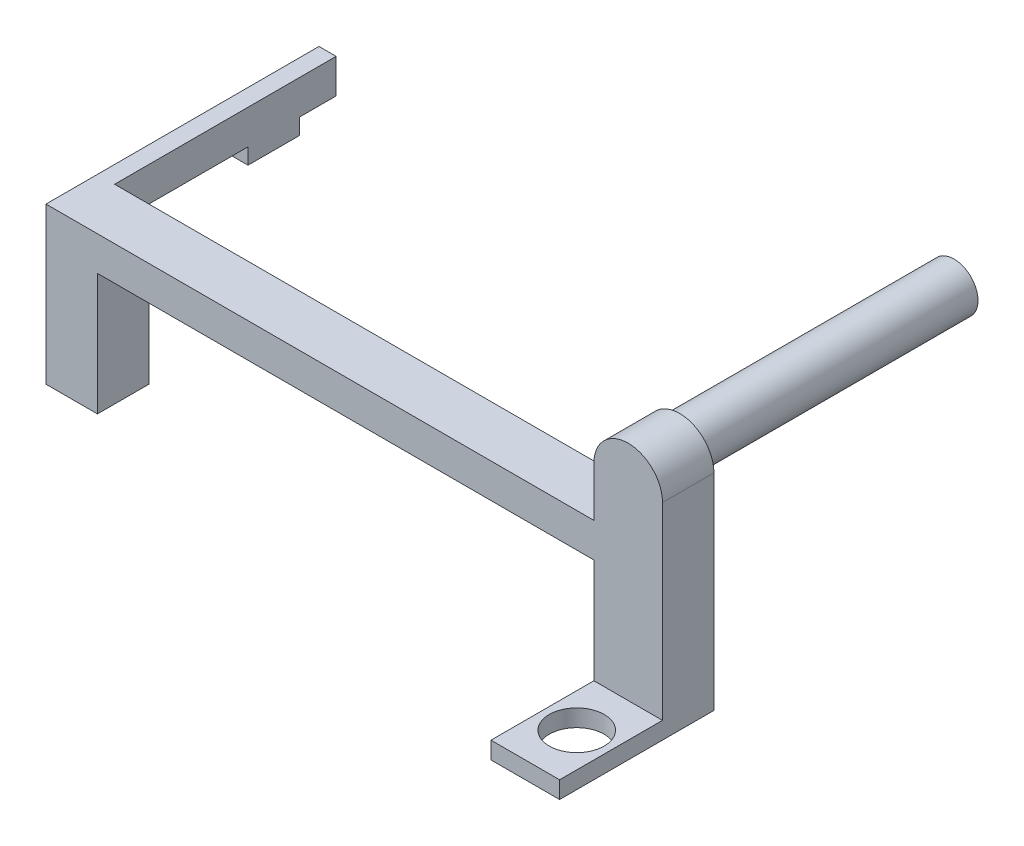
ISO-10303-21;
HEADER;
FILE_DESCRIPTION(('STEP AP214'),'2;1');
FILE_NAME('part.step','',(''),(''),'','','');
FILE_SCHEMA(('AUTOMOTIVE_DESIGN { 1 0 10303 214 1 1 1 1 }'));
ENDSEC;
DATA;
#1=APPLICATION_CONTEXT('core data for automotive mechanical design processes');
#2=APPLICATION_PROTOCOL_DEFINITION('international standard','automotive_design',2000,#1);
#3=PRODUCT_CONTEXT('',#1,'mechanical');
#4=PRODUCT('Part','Part','',(#3));
#5=PRODUCT_RELATED_PRODUCT_CATEGORY('part','',(#4));
#6=PRODUCT_DEFINITION_FORMATION('','',#4);
#7=PRODUCT_DEFINITION_CONTEXT('part definition',#1,'design');
#8=PRODUCT_DEFINITION('design','',#6,#7);
#9=PRODUCT_DEFINITION_SHAPE('','',#8);
#10=(LENGTH_UNIT() NAMED_UNIT(*) SI_UNIT(.MILLI.,.METRE.));
#11=(NAMED_UNIT(*) PLANE_ANGLE_UNIT() SI_UNIT($,.RADIAN.));
#12=(NAMED_UNIT(*) SI_UNIT($,.STERADIAN.) SOLID_ANGLE_UNIT());
#13=UNCERTAINTY_MEASURE_WITH_UNIT(LENGTH_MEASURE(1.E-05),#10,'distance_accuracy_value','');
#14=(GEOMETRIC_REPRESENTATION_CONTEXT(3) GLOBAL_UNCERTAINTY_ASSIGNED_CONTEXT((#13)) GLOBAL_UNIT_ASSIGNED_CONTEXT((#10,
#11,#12)) REPRESENTATION_CONTEXT('',''));
#15=CARTESIAN_POINT('',(0.,0.,0.));
#16=DIRECTION('',(0.,0.,1.));
#17=DIRECTION('',(1.,0.,0.));
#18=AXIS2_PLACEMENT_3D('',#15,#16,#17);
#19=CARTESIAN_POINT('',(-34.3841463414634,-3.49756097560976,0.));
#20=DIRECTION('',(0.,1.,0.));
#21=DIRECTION('',(-1.,0.,0.));
#22=AXIS2_PLACEMENT_3D('',#19,#20,#21);
#23=PLANE('',#22);
#24=DIRECTION('',(1.,0.,0.));
#25=VECTOR('',#24,1.);
#26=CARTESIAN_POINT('',(-35.3841463414634,-3.49756097560976,0.));
#27=LINE('',#26,#25);
#28=CARTESIAN_POINT('',(-35.3841463414634,-3.49756097560976,0.));
#29=VERTEX_POINT('',#28);
#30=CARTESIAN_POINT('',(-34.3841463414634,-3.49756097560976,0.));
#31=VERTEX_POINT('',#30);
#32=EDGE_CURVE('E406',#29,#31,#27,.T.);
#33=ORIENTED_EDGE('',*,*,#32,.F.);
#34=DIRECTION('',(0.,0.,1.));
#35=VECTOR('',#34,1.);
#36=CARTESIAN_POINT('',(-35.3841463414634,-3.49756097560976,0.));
#37=LINE('',#36,#35);
#38=CARTESIAN_POINT('',(-35.3841463414634,-3.49756097560976,-7.78));
#39=VERTEX_POINT('',#38);
#40=EDGE_CURVE('E66',#39,#29,#37,.T.);
#41=ORIENTED_EDGE('',*,*,#40,.F.);
#42=DIRECTION('',(-1.,0.,0.));
#43=VECTOR('',#42,1.);
#44=CARTESIAN_POINT('',(-35.3841463414634,-3.49756097560976,-7.78));
#45=LINE('',#44,#43);
#46=CARTESIAN_POINT('',(-34.3841463414634,-3.49756097560976,-7.78));
#47=VERTEX_POINT('',#46);
#48=EDGE_CURVE('E212',#47,#39,#45,.T.);
#49=ORIENTED_EDGE('',*,*,#48,.F.);
#50=DIRECTION('',(0.,0.,1.));
#51=VECTOR('',#50,1.);
#52=CARTESIAN_POINT('',(-34.3841463414634,-3.49756097560976,-3.));
#53=LINE('',#52,#51);
#54=EDGE_CURVE('E268',#47,#31,#53,.T.);
#55=ORIENTED_EDGE('',*,*,#54,.T.);
#56=EDGE_LOOP('',(#33,#41,#49,#55));
#57=FACE_BOUND('',#56,.T.);
#58=ADVANCED_FACE('F49',(#57),#23,.F.);
#59=DIRECTION('',(0.,0.,1.));
#60=VECTOR('',#59,1.);
#61=CARTESIAN_POINT('',(-32.3841463414634,-3.49756097560976,3.));
#62=LINE('',#61,#60);
#63=CARTESIAN_POINT('',(-32.3841463414634,-3.49756097560976,0.));
#64=VERTEX_POINT('',#63);
#65=CARTESIAN_POINT('',(-32.3841463414634,-3.49756097560976,3.));
#66=VERTEX_POINT('',#65);
#67=EDGE_CURVE('E204',#64,#66,#62,.T.);
#68=ORIENTED_EDGE('',*,*,#67,.F.);
#69=DIRECTION('',(1.,0.,0.));
#70=VECTOR('',#69,1.);
#71=CARTESIAN_POINT('',(-34.3841463414634,-3.49756097560976,0.));
#72=LINE('',#71,#70);
#73=CARTESIAN_POINT('',(-3.43414634146343,-3.49756097560976,0.));
#74=VERTEX_POINT('',#73);
#75=EDGE_CURVE('E302',#64,#74,#72,.T.);
#76=ORIENTED_EDGE('',*,*,#75,.T.);
#77=DIRECTION('',(0.,0.,1.));
#78=VECTOR('',#77,1.);
#79=CARTESIAN_POINT('',(-3.43414634146343,-3.49756097560976,0.));
#80=LINE('',#79,#78);
#81=CARTESIAN_POINT('',(-3.43414634146343,-3.49756097560976,3.));
#82=VERTEX_POINT('',#81);
#83=EDGE_CURVE('E284',#74,#82,#80,.T.);
#84=ORIENTED_EDGE('',*,*,#83,.T.);
#85=DIRECTION('',(1.,0.,0.));
#86=VECTOR('',#85,1.);
#87=CARTESIAN_POINT('',(-34.3841463414634,-3.49756097560976,3.));
#88=LINE('',#87,#86);
#89=EDGE_CURVE('E299',#66,#82,#88,.T.);
#90=ORIENTED_EDGE('',*,*,#89,.F.);
#91=EDGE_LOOP('',(#68,#76,#84,#90));
#92=FACE_BOUND('',#91,.T.);
#93=ADVANCED_FACE('F449',(#92),#23,.F.);
#94=DIRECTION('',(1.,0.,0.));
#95=VECTOR('',#94,1.);
#96=CARTESIAN_POINT('',(-35.3841463414634,-3.49756097560976,-10.78));
#97=LINE('',#96,#95);
#98=CARTESIAN_POINT('',(-35.3841463414634,-3.49756097560976,-10.78));
#99=VERTEX_POINT('',#98);
#100=CARTESIAN_POINT('',(-34.3841463414634,-3.49756097560976,-10.78));
#101=VERTEX_POINT('',#100);
#102=EDGE_CURVE('E74',#99,#101,#97,.T.);
#103=ORIENTED_EDGE('',*,*,#102,.F.);
#104=CARTESIAN_POINT('',(-35.3841463414634,-3.49756097560976,-12.92));
#105=VERTEX_POINT('',#104);
#106=EDGE_CURVE('E275',#105,#99,#37,.T.);
#107=ORIENTED_EDGE('',*,*,#106,.F.);
#108=DIRECTION('',(-1.,0.,0.));
#109=VECTOR('',#108,1.);
#110=CARTESIAN_POINT('',(-34.3841463414634,-3.49756097560976,-12.92));
#111=LINE('',#110,#109);
#112=CARTESIAN_POINT('',(-34.3841463414634,-3.49756097560976,-12.92));
#113=VERTEX_POINT('',#112);
#114=EDGE_CURVE('E252',#113,#105,#111,.T.);
#115=ORIENTED_EDGE('',*,*,#114,.F.);
#116=EDGE_CURVE('E269',#113,#101,#53,.T.);
#117=ORIENTED_EDGE('',*,*,#116,.T.);
#118=EDGE_LOOP('',(#103,#107,#115,#117));
#119=FACE_BOUND('',#118,.T.);
#120=ADVANCED_FACE('F451',(#119),#23,.F.);
#121=CARTESIAN_POINT('',(0.,0.,0.));
#122=DIRECTION('',(0.,0.,1.));
#123=DIRECTION('',(1.,0.,0.));
#124=AXIS2_PLACEMENT_3D('',#121,#122,#123);
#125=PLANE('',#124);
#126=CARTESIAN_POINT('',(-1.43414634146342,1.80243902439024,0.));
#127=DIRECTION('',(0.,0.,1.));
#128=DIRECTION('',(1.,0.,0.));
#129=AXIS2_PLACEMENT_3D('',#126,#127,#128);
#130=CIRCLE('',#129,1.4);
#131=CARTESIAN_POINT('',(-0.034146341463424,1.80243902439024,0.));
#132=VERTEX_POINT('',#131);
#133=EDGE_CURVE('E371',#132,#132,#130,.F.);
#134=ORIENTED_EDGE('',*,*,#133,.F.);
#135=EDGE_LOOP('',(#134));
#136=FACE_BOUND('',#135,.T.);
#137=DIRECTION('',(0.,-1.,0.));
#138=VECTOR('',#137,1.);
#139=CARTESIAN_POINT('',(-34.3841463414634,-1.49756097560976,0.));
#140=LINE('',#139,#138);
#141=CARTESIAN_POINT('',(-34.3841463414634,-1.49756097560976,0.));
#142=VERTEX_POINT('',#141);
#143=EDGE_CURVE('E264',#142,#31,#140,.T.);
#144=ORIENTED_EDGE('',*,*,#143,.F.);
#145=DIRECTION('',(1.,0.,0.));
#146=VECTOR('',#145,1.);
#147=CARTESIAN_POINT('',(-34.3841463414634,-1.49756097560976,0.));
#148=LINE('',#147,#146);
#149=CARTESIAN_POINT('',(-3.43414634146343,-1.49756097560976,0.));
#150=VERTEX_POINT('',#149);
#151=EDGE_CURVE('E292',#142,#150,#148,.T.);
#152=ORIENTED_EDGE('',*,*,#151,.T.);
#153=DIRECTION('',(0.,-1.,0.));
#154=VECTOR('',#153,1.);
#155=CARTESIAN_POINT('',(-3.43414634146343,3.40243902439024,0.));
#156=LINE('',#155,#154);
#157=CARTESIAN_POINT('',(-3.43414634146343,1.40243902439024,0.));
#158=VERTEX_POINT('',#157);
#159=EDGE_CURVE('E353',#158,#150,#156,.T.);
#160=ORIENTED_EDGE('',*,*,#159,.F.);
#161=CARTESIAN_POINT('',(-1.43414634146343,1.40243902439024,0.));
#162=DIRECTION('',(0.,0.,1.));
#163=DIRECTION('',(1.,0.,0.));
#164=AXIS2_PLACEMENT_3D('',#161,#162,#163);
#165=CIRCLE('',#164,2.);
#166=CARTESIAN_POINT('',(0.565853658536575,1.40243902439024,0.));
#167=VERTEX_POINT('',#166);
#168=EDGE_CURVE('E11',#158,#167,#165,.F.);
#169=ORIENTED_EDGE('',*,*,#168,.T.);
#170=DIRECTION('',(0.,1.,0.));
#171=VECTOR('',#170,1.);
#172=CARTESIAN_POINT('',(0.565853658536575,3.40243902439024,0.));
#173=LINE('',#172,#171);
#174=CARTESIAN_POINT('',(0.565853658536576,-10.5975609756098,0.));
#175=VERTEX_POINT('',#174);
#176=EDGE_CURVE('E360',#175,#167,#173,.T.);
#177=ORIENTED_EDGE('',*,*,#176,.F.);
#178=DIRECTION('',(1.,0.,0.));
#179=VECTOR('',#178,1.);
#180=CARTESIAN_POINT('',(-3.43414634146342,-10.5975609756098,0.));
#181=LINE('',#180,#179);
#182=CARTESIAN_POINT('',(-3.43414634146342,-10.5975609756098,0.));
#183=VERTEX_POINT('',#182);
#184=EDGE_CURVE('E357',#183,#175,#181,.T.);
#185=ORIENTED_EDGE('',*,*,#184,.F.);
#186=EDGE_CURVE('E343',#74,#183,#156,.T.);
#187=ORIENTED_EDGE('',*,*,#186,.F.);
#188=ORIENTED_EDGE('',*,*,#75,.F.);
#189=DIRECTION('',(0.,1.,0.));
#190=VECTOR('',#189,1.);
#191=CARTESIAN_POINT('',(-32.3841463414634,-10.5975609756098,0.));
#192=LINE('',#191,#190);
#193=CARTESIAN_POINT('',(-32.3841463414634,-10.5975609756098,0.));
#194=VERTEX_POINT('',#193);
#195=EDGE_CURVE('E189',#194,#64,#192,.T.);
#196=ORIENTED_EDGE('',*,*,#195,.F.);
#197=DIRECTION('',(1.,0.,0.));
#198=VECTOR('',#197,1.);
#199=CARTESIAN_POINT('',(-35.3841463414634,-10.5975609756098,0.));
#200=LINE('',#199,#198);
#201=CARTESIAN_POINT('',(-35.3841463414634,-10.5975609756098,0.));
#202=VERTEX_POINT('',#201);
#203=EDGE_CURVE('E182',#202,#194,#200,.T.);
#204=ORIENTED_EDGE('',*,*,#203,.F.);
#205=DIRECTION('',(0.,1.,0.));
#206=VECTOR('',#205,1.);
#207=CARTESIAN_POINT('',(-35.3841463414634,-10.5975609756098,0.));
#208=LINE('',#207,#206);
#209=EDGE_CURVE('E187',#202,#29,#208,.T.);
#210=ORIENTED_EDGE('',*,*,#209,.T.);
#211=ORIENTED_EDGE('',*,*,#32,.T.);
#212=EDGE_LOOP('',(#144,#152,#160,#169,#177,#185,#187,#188,#196,#204,#210,#211));
#213=FACE_BOUND('',#212,.T.);
#214=ADVANCED_FACE('F185',(#136,#213),#125,.F.);
#215=CARTESIAN_POINT('',(-3.43414634146343,3.40243902439024,3.));
#216=DIRECTION('',(1.,0.,0.));
#217=DIRECTION('',(0.,1.,0.));
#218=AXIS2_PLACEMENT_3D('',#215,#216,#217);
#219=PLANE('',#218);
#220=ORIENTED_EDGE('',*,*,#83,.F.);
#221=ORIENTED_EDGE('',*,*,#186,.T.);
#222=DIRECTION('',(0.,0.,-1.));
#223=VECTOR('',#222,1.);
#224=CARTESIAN_POINT('',(-3.43414634146342,-10.5975609756098,3.));
#225=LINE('',#224,#223);
#226=CARTESIAN_POINT('',(-3.43414634146342,-10.5975609756098,9.));
#227=VERTEX_POINT('',#226);
#228=EDGE_CURVE('E367',#227,#183,#225,.T.);
#229=ORIENTED_EDGE('',*,*,#228,.F.);
#230=DIRECTION('',(0.,-1.,0.));
#231=VECTOR('',#230,1.);
#232=CARTESIAN_POINT('',(-3.43414634146343,-9.59756097560976,9.));
#233=LINE('',#232,#231);
#234=CARTESIAN_POINT('',(-3.43414634146343,-9.59756097560976,9.));
#235=VERTEX_POINT('',#234);
#236=EDGE_CURVE('E314',#235,#227,#233,.T.);
#237=ORIENTED_EDGE('',*,*,#236,.F.);
#238=DIRECTION('',(0.,0.,-1.));
#239=VECTOR('',#238,1.);
#240=CARTESIAN_POINT('',(-3.43414634146343,-9.59756097560976,9.));
#241=LINE('',#240,#239);
#242=CARTESIAN_POINT('',(-3.43414634146343,-9.59756097560976,3.));
#243=VERTEX_POINT('',#242);
#244=EDGE_CURVE('E328',#235,#243,#241,.T.);
#245=ORIENTED_EDGE('',*,*,#244,.T.);
#246=DIRECTION('',(0.,-1.,0.));
#247=VECTOR('',#246,1.);
#248=CARTESIAN_POINT('',(-3.43414634146343,3.40243902439024,3.));
#249=LINE('',#248,#247);
#250=EDGE_CURVE('E349',#82,#243,#249,.T.);
#251=ORIENTED_EDGE('',*,*,#250,.F.);
#252=EDGE_LOOP('',(#220,#221,#229,#237,#245,#251));
#253=FACE_BOUND('',#252,.T.);
#254=ADVANCED_FACE('F426',(#253),#219,.F.);
#255=DIRECTION('',(0.,0.,-1.));
#256=VECTOR('',#255,1.);
#257=CARTESIAN_POINT('',(-3.43414634146343,-1.49756097560976,0.));
#258=LINE('',#257,#256);
#259=CARTESIAN_POINT('',(-3.43414634146343,-1.49756097560976,3.));
#260=VERTEX_POINT('',#259);
#261=EDGE_CURVE('E288',#260,#150,#258,.T.);
#262=ORIENTED_EDGE('',*,*,#261,.F.);
#263=CARTESIAN_POINT('',(-3.43414634146343,1.40243902439024,3.));
#264=VERTEX_POINT('',#263);
#265=EDGE_CURVE('E344',#264,#260,#249,.T.);
#266=ORIENTED_EDGE('',*,*,#265,.F.);
#267=DIRECTION('',(0.,0.,-1.));
#268=VECTOR('',#267,1.);
#269=CARTESIAN_POINT('',(-3.43414634146343,1.40243902439024,3.));
#270=LINE('',#269,#268);
#271=EDGE_CURVE('E375',#264,#158,#270,.T.);
#272=ORIENTED_EDGE('',*,*,#271,.T.);
#273=ORIENTED_EDGE('',*,*,#159,.T.);
#274=EDGE_LOOP('',(#262,#266,#272,#273));
#275=FACE_BOUND('',#274,.T.);
#276=ADVANCED_FACE('F393',(#275),#219,.F.);
#277=CARTESIAN_POINT('',(-1.43414634146343,1.40243902439024,3.));
#278=DIRECTION('',(0.,0.,-1.));
#279=DIRECTION('',(-1.,0.,0.));
#280=AXIS2_PLACEMENT_3D('',#277,#278,#279);
#281=CYLINDRICAL_SURFACE('',#280,2.);
#282=ORIENTED_EDGE('',*,*,#271,.F.);
#283=CARTESIAN_POINT('',(-1.43414634146343,1.40243902439024,3.));
#284=DIRECTION('',(0.,0.,1.));
#285=DIRECTION('',(1.,0.,0.));
#286=AXIS2_PLACEMENT_3D('',#283,#284,#285);
#287=CIRCLE('',#286,2.);
#288=CARTESIAN_POINT('',(0.565853658536575,1.40243902439024,3.));
#289=VERTEX_POINT('',#288);
#290=EDGE_CURVE('E59',#289,#264,#287,.T.);
#291=ORIENTED_EDGE('',*,*,#290,.F.);
#292=DIRECTION('',(0.,0.,-1.));
#293=VECTOR('',#292,1.);
#294=CARTESIAN_POINT('',(0.565853658536575,1.40243902439024,3.));
#295=LINE('',#294,#293);
#296=EDGE_CURVE('E379',#167,#289,#295,.F.);
#297=ORIENTED_EDGE('',*,*,#296,.F.);
#298=ORIENTED_EDGE('',*,*,#168,.F.);
#299=EDGE_LOOP('',(#282,#291,#297,#298));
#300=FACE_BOUND('',#299,.T.);
#301=ADVANCED_FACE('F52',(#300),#281,.T.);
#302=CARTESIAN_POINT('',(-3.43414634146342,-10.5975609756098,3.));
#303=DIRECTION('',(0.,1.,0.));
#304=DIRECTION('',(0.,0.,1.));
#305=AXIS2_PLACEMENT_3D('',#302,#303,#304);
#306=PLANE('',#305);
#307=CARTESIAN_POINT('',(-1.43414634146342,-10.5975609756098,6.));
#308=DIRECTION('',(0.,1.,0.));
#309=DIRECTION('',(0.,0.,1.));
#310=AXIS2_PLACEMENT_3D('',#307,#308,#309);
#311=CIRCLE('',#310,1.6);
#312=CARTESIAN_POINT('',(-1.43414634146342,-10.5975609756098,7.6));
#313=VERTEX_POINT('',#312);
#314=EDGE_CURVE('E309',#313,#313,#311,.T.);
#315=ORIENTED_EDGE('',*,*,#314,.T.);
#316=EDGE_LOOP('',(#315));
#317=FACE_BOUND('',#316,.T.);
#318=ORIENTED_EDGE('',*,*,#184,.T.);
#319=DIRECTION('',(0.,0.,-1.));
#320=VECTOR('',#319,1.);
#321=CARTESIAN_POINT('',(0.565853658536576,-10.5975609756098,3.));
#322=LINE('',#321,#320);
#323=CARTESIAN_POINT('',(0.565853658536576,-10.5975609756098,9.));
#324=VERTEX_POINT('',#323);
#325=EDGE_CURVE('E352',#324,#175,#322,.T.);
#326=ORIENTED_EDGE('',*,*,#325,.F.);
#327=DIRECTION('',(1.,0.,0.));
#328=VECTOR('',#327,1.);
#329=CARTESIAN_POINT('',(-3.43414634146342,-10.5975609756098,9.));
#330=LINE('',#329,#328);
#331=EDGE_CURVE('E318',#227,#324,#330,.T.);
#332=ORIENTED_EDGE('',*,*,#331,.F.);
#333=ORIENTED_EDGE('',*,*,#228,.T.);
#334=EDGE_LOOP('',(#318,#326,#332,#333));
#335=FACE_BOUND('',#334,.T.);
#336=ADVANCED_FACE('F437',(#317,#335),#306,.F.);
#337=CARTESIAN_POINT('',(0.565853658536575,3.40243902439024,3.));
#338=DIRECTION('',(-1.,0.,0.));
#339=DIRECTION('',(0.,-1.,0.));
#340=AXIS2_PLACEMENT_3D('',#337,#338,#339);
#341=PLANE('',#340);
#342=ORIENTED_EDGE('',*,*,#176,.T.);
#343=ORIENTED_EDGE('',*,*,#296,.T.);
#344=DIRECTION('',(0.,1.,0.));
#345=VECTOR('',#344,1.);
#346=CARTESIAN_POINT('',(0.565853658536575,3.40243902439024,3.));
#347=LINE('',#346,#345);
#348=CARTESIAN_POINT('',(0.565853658536576,-9.59756097560976,3.));
#349=VERTEX_POINT('',#348);
#350=EDGE_CURVE('E348',#349,#289,#347,.T.);
#351=ORIENTED_EDGE('',*,*,#350,.F.);
#352=DIRECTION('',(0.,0.,-1.));
#353=VECTOR('',#352,1.);
#354=CARTESIAN_POINT('',(0.565853658536576,-9.59756097560976,9.));
#355=LINE('',#354,#353);
#356=CARTESIAN_POINT('',(0.565853658536576,-9.59756097560976,9.));
#357=VERTEX_POINT('',#356);
#358=EDGE_CURVE('E335',#357,#349,#355,.T.);
#359=ORIENTED_EDGE('',*,*,#358,.F.);
#360=DIRECTION('',(0.,1.,0.));
#361=VECTOR('',#360,1.);
#362=CARTESIAN_POINT('',(0.565853658536576,-9.59756097560976,9.));
#363=LINE('',#362,#361);
#364=EDGE_CURVE('E322',#324,#357,#363,.T.);
#365=ORIENTED_EDGE('',*,*,#364,.F.);
#366=ORIENTED_EDGE('',*,*,#325,.T.);
#367=EDGE_LOOP('',(#342,#343,#351,#359,#365,#366));
#368=FACE_BOUND('',#367,.T.);
#369=ADVANCED_FACE('F432',(#368),#341,.F.);
#370=CARTESIAN_POINT('',(0.,0.,3.));
#371=DIRECTION('',(0.,0.,1.));
#372=DIRECTION('',(1.,0.,0.));
#373=AXIS2_PLACEMENT_3D('',#370,#371,#372);
#374=PLANE('',#373);
#375=DIRECTION('',(-1.,0.,0.));
#376=VECTOR('',#375,1.);
#377=CARTESIAN_POINT('',(-3.43414634146343,-9.59756097560976,3.));
#378=LINE('',#377,#376);
#379=EDGE_CURVE('E313',#349,#243,#378,.T.);
#380=ORIENTED_EDGE('',*,*,#379,.F.);
#381=ORIENTED_EDGE('',*,*,#350,.T.);
#382=ORIENTED_EDGE('',*,*,#290,.T.);
#383=ORIENTED_EDGE('',*,*,#265,.T.);
#384=DIRECTION('',(1.,0.,0.));
#385=VECTOR('',#384,1.);
#386=CARTESIAN_POINT('',(-34.3841463414634,-1.49756097560976,3.));
#387=LINE('',#386,#385);
#388=CARTESIAN_POINT('',(-35.3841463414634,-1.49756097560976,3.));
#389=VERTEX_POINT('',#388);
#390=EDGE_CURVE('E295',#389,#260,#387,.T.);
#391=ORIENTED_EDGE('',*,*,#390,.F.);
#392=DIRECTION('',(0.,1.,0.));
#393=VECTOR('',#392,1.);
#394=CARTESIAN_POINT('',(-35.3841463414634,-1.49756097560976,3.));
#395=LINE('',#394,#393);
#396=CARTESIAN_POINT('',(-35.3841463414634,-10.5975609756098,3.));
#397=VERTEX_POINT('',#396);
#398=EDGE_CURVE('E278',#397,#389,#395,.T.);
#399=ORIENTED_EDGE('',*,*,#398,.F.);
#400=DIRECTION('',(-1.,0.,0.));
#401=VECTOR('',#400,1.);
#402=CARTESIAN_POINT('',(-35.3841463414634,-10.5975609756098,3.));
#403=LINE('',#402,#401);
#404=CARTESIAN_POINT('',(-32.3841463414634,-10.5975609756098,3.));
#405=VERTEX_POINT('',#404);
#406=EDGE_CURVE('E200',#405,#397,#403,.T.);
#407=ORIENTED_EDGE('',*,*,#406,.F.);
#408=DIRECTION('',(0.,1.,0.));
#409=VECTOR('',#408,1.);
#410=CARTESIAN_POINT('',(-32.3841463414634,-10.5975609756098,3.));
#411=LINE('',#410,#409);
#412=EDGE_CURVE('E214',#405,#66,#411,.T.);
#413=ORIENTED_EDGE('',*,*,#412,.T.);
#414=ORIENTED_EDGE('',*,*,#89,.T.);
#415=ORIENTED_EDGE('',*,*,#250,.T.);
#416=EDGE_LOOP('',(#380,#381,#382,#383,#391,#399,#407,#413,#414,#415));
#417=FACE_BOUND('',#416,.T.);
#418=ADVANCED_FACE('F386',(#417),#374,.T.);
#419=CARTESIAN_POINT('',(-1.43414634146342,1.80243902439024,-16.));
#420=DIRECTION('',(0.,0.,1.));
#421=DIRECTION('',(1.,0.,0.));
#422=AXIS2_PLACEMENT_3D('',#419,#420,#421);
#423=CYLINDRICAL_SURFACE('',#422,1.4);
#424=CARTESIAN_POINT('',(-1.43414634146342,1.80243902439024,-16.));
#425=DIRECTION('',(0.,0.,-1.));
#426=DIRECTION('',(-1.,0.,0.));
#427=AXIS2_PLACEMENT_3D('',#424,#425,#426);
#428=CIRCLE('',#427,1.4);
#429=CARTESIAN_POINT('',(-2.83414634146342,1.80243902439024,-16.));
#430=VERTEX_POINT('',#429);
#431=EDGE_CURVE('E339',#430,#430,#428,.T.);
#432=ORIENTED_EDGE('',*,*,#431,.F.);
#433=EDGE_LOOP('',(#432));
#434=FACE_BOUND('',#433,.T.);
#435=ORIENTED_EDGE('',*,*,#133,.T.);
#436=EDGE_LOOP('',(#435));
#437=FACE_BOUND('',#436,.T.);
#438=ADVANCED_FACE('F474',(#434,#437),#423,.T.);
#439=CARTESIAN_POINT('',(-1.43414634146342,1.80243902439024,-16.));
#440=DIRECTION('',(0.,0.,-1.));
#441=DIRECTION('',(-1.,0.,0.));
#442=AXIS2_PLACEMENT_3D('',#439,#440,#441);
#443=PLANE('',#442);
#444=ORIENTED_EDGE('',*,*,#431,.T.);
#445=EDGE_LOOP('',(#444));
#446=FACE_BOUND('',#445,.T.);
#447=ADVANCED_FACE('F477',(#446),#443,.T.);
#448=CARTESIAN_POINT('',(-3.43414634146343,-9.59756097560976,9.));
#449=DIRECTION('',(0.,-1.,0.));
#450=DIRECTION('',(0.,0.,-1.));
#451=AXIS2_PLACEMENT_3D('',#448,#449,#450);
#452=PLANE('',#451);
#453=CARTESIAN_POINT('',(-1.43414634146342,-9.59756097560976,6.));
#454=DIRECTION('',(0.,1.,0.));
#455=DIRECTION('',(0.,0.,1.));
#456=AXIS2_PLACEMENT_3D('',#453,#454,#455);
#457=CIRCLE('',#456,1.6);
#458=CARTESIAN_POINT('',(-1.43414634146342,-9.59756097560976,7.6));
#459=VERTEX_POINT('',#458);
#460=EDGE_CURVE('E305',#459,#459,#457,.T.);
#461=ORIENTED_EDGE('',*,*,#460,.F.);
#462=EDGE_LOOP('',(#461));
#463=FACE_BOUND('',#462,.T.);
#464=ORIENTED_EDGE('',*,*,#379,.T.);
#465=ORIENTED_EDGE('',*,*,#244,.F.);
#466=DIRECTION('',(-1.,0.,0.));
#467=VECTOR('',#466,1.);
#468=CARTESIAN_POINT('',(-3.43414634146343,-9.59756097560976,9.));
#469=LINE('',#468,#467);
#470=EDGE_CURVE('E325',#357,#235,#469,.T.);
#471=ORIENTED_EDGE('',*,*,#470,.F.);
#472=ORIENTED_EDGE('',*,*,#358,.T.);
#473=EDGE_LOOP('',(#464,#465,#471,#472));
#474=FACE_BOUND('',#473,.T.);
#475=ADVANCED_FACE('F422',(#463,#474),#452,.F.);
#476=CARTESIAN_POINT('',(0.,0.,9.));
#477=DIRECTION('',(0.,0.,1.));
#478=DIRECTION('',(1.,0.,0.));
#479=AXIS2_PLACEMENT_3D('',#476,#477,#478);
#480=PLANE('',#479);
#481=ORIENTED_EDGE('',*,*,#236,.T.);
#482=ORIENTED_EDGE('',*,*,#331,.T.);
#483=ORIENTED_EDGE('',*,*,#364,.T.);
#484=ORIENTED_EDGE('',*,*,#470,.T.);
#485=EDGE_LOOP('',(#481,#482,#483,#484));
#486=FACE_BOUND('',#485,.T.);
#487=ADVANCED_FACE('F429',(#486),#480,.T.);
#488=CARTESIAN_POINT('',(-1.43414634146342,-15.5975609756098,6.));
#489=DIRECTION('',(0.,1.,0.));
#490=DIRECTION('',(0.,0.,1.));
#491=AXIS2_PLACEMENT_3D('',#488,#489,#490);
#492=CYLINDRICAL_SURFACE('',#491,1.6);
#493=ORIENTED_EDGE('',*,*,#460,.T.);
#494=EDGE_LOOP('',(#493));
#495=FACE_BOUND('',#494,.T.);
#496=ORIENTED_EDGE('',*,*,#314,.F.);
#497=EDGE_LOOP('',(#496));
#498=FACE_BOUND('',#497,.T.);
#499=ADVANCED_FACE('F484',(#495,#498),#492,.F.);
#500=CARTESIAN_POINT('',(-34.3841463414634,-1.49756097560976,0.));
#501=DIRECTION('',(0.,-1.,0.));
#502=DIRECTION('',(1.,0.,0.));
#503=AXIS2_PLACEMENT_3D('',#500,#501,#502);
#504=PLANE('',#503);
#505=ORIENTED_EDGE('',*,*,#261,.T.);
#506=ORIENTED_EDGE('',*,*,#151,.F.);
#507=DIRECTION('',(0.,0.,1.));
#508=VECTOR('',#507,1.);
#509=CARTESIAN_POINT('',(-34.3841463414634,-1.49756097560976,-3.));
#510=LINE('',#509,#508);
#511=CARTESIAN_POINT('',(-34.3841463414634,-1.49756097560976,-12.92));
#512=VERTEX_POINT('',#511);
#513=EDGE_CURVE('E272',#512,#142,#510,.T.);
#514=ORIENTED_EDGE('',*,*,#513,.F.);
#515=DIRECTION('',(1.,0.,0.));
#516=VECTOR('',#515,1.);
#517=CARTESIAN_POINT('',(-34.3841463414634,-1.49756097560976,-12.92));
#518=LINE('',#517,#516);
#519=CARTESIAN_POINT('',(-35.3841463414634,-1.49756097560976,-12.92));
#520=VERTEX_POINT('',#519);
#521=EDGE_CURVE('E260',#520,#512,#518,.T.);
#522=ORIENTED_EDGE('',*,*,#521,.F.);
#523=DIRECTION('',(0.,0.,-1.));
#524=VECTOR('',#523,1.);
#525=CARTESIAN_POINT('',(-35.3841463414634,-1.49756097560976,0.));
#526=LINE('',#525,#524);
#527=EDGE_CURVE('E281',#389,#520,#526,.T.);
#528=ORIENTED_EDGE('',*,*,#527,.F.);
#529=ORIENTED_EDGE('',*,*,#390,.T.);
#530=EDGE_LOOP('',(#505,#506,#514,#522,#528,#529));
#531=FACE_BOUND('',#530,.T.);
#532=ADVANCED_FACE('F396',(#531),#504,.F.);
#533=CARTESIAN_POINT('',(-35.3841463414634,0.,0.));
#534=DIRECTION('',(-1.,0.,0.));
#535=DIRECTION('',(0.,0.,1.));
#536=AXIS2_PLACEMENT_3D('',#533,#534,#535);
#537=PLANE('',#536);
#538=ORIENTED_EDGE('',*,*,#527,.T.);
#539=DIRECTION('',(0.,1.,0.));
#540=VECTOR('',#539,1.);
#541=CARTESIAN_POINT('',(-35.3841463414634,-1.49756097560976,-12.92));
#542=LINE('',#541,#540);
#543=EDGE_CURVE('E256',#105,#520,#542,.T.);
#544=ORIENTED_EDGE('',*,*,#543,.F.);
#545=ORIENTED_EDGE('',*,*,#106,.T.);
#546=DIRECTION('',(0.,1.,0.));
#547=VECTOR('',#546,1.);
#548=CARTESIAN_POINT('',(-35.3841463414634,-4.42756097560976,-10.78));
#549=LINE('',#548,#547);
#550=CARTESIAN_POINT('',(-35.3841463414634,-4.42756097560976,-10.78));
#551=VERTEX_POINT('',#550);
#552=EDGE_CURVE('E244',#551,#99,#549,.T.);
#553=ORIENTED_EDGE('',*,*,#552,.F.);
#554=DIRECTION('',(0.,0.,-1.));
#555=VECTOR('',#554,1.);
#556=CARTESIAN_POINT('',(-35.3841463414634,-4.42756097560976,-7.78));
#557=LINE('',#556,#555);
#558=CARTESIAN_POINT('',(-35.3841463414634,-4.42756097560976,-7.78));
#559=VERTEX_POINT('',#558);
#560=EDGE_CURVE('E218',#559,#551,#557,.T.);
#561=ORIENTED_EDGE('',*,*,#560,.F.);
#562=DIRECTION('',(0.,1.,0.));
#563=VECTOR('',#562,1.);
#564=CARTESIAN_POINT('',(-35.3841463414634,-4.42756097560976,-7.78));
#565=LINE('',#564,#563);
#566=EDGE_CURVE('E230',#559,#39,#565,.T.);
#567=ORIENTED_EDGE('',*,*,#566,.T.);
#568=ORIENTED_EDGE('',*,*,#40,.T.);
#569=ORIENTED_EDGE('',*,*,#209,.F.);
#570=DIRECTION('',(0.,0.,-1.));
#571=VECTOR('',#570,1.);
#572=CARTESIAN_POINT('',(-35.3841463414634,-10.5975609756098,3.));
#573=LINE('',#572,#571);
#574=EDGE_CURVE('E194',#397,#202,#573,.T.);
#575=ORIENTED_EDGE('',*,*,#574,.F.);
#576=ORIENTED_EDGE('',*,*,#398,.T.);
#577=EDGE_LOOP('',(#538,#544,#545,#553,#561,#567,#568,#569,#575,#576));
#578=FACE_BOUND('',#577,.T.);
#579=ADVANCED_FACE('F206',(#578),#537,.T.);
#580=CARTESIAN_POINT('',(-34.3841463414634,-1.49756097560976,-3.));
#581=DIRECTION('',(-1.,0.,0.));
#582=DIRECTION('',(0.,0.,1.));
#583=AXIS2_PLACEMENT_3D('',#580,#581,#582);
#584=PLANE('',#583);
#585=ORIENTED_EDGE('',*,*,#143,.T.);
#586=ORIENTED_EDGE('',*,*,#54,.F.);
#587=DIRECTION('',(0.,1.,0.));
#588=VECTOR('',#587,1.);
#589=CARTESIAN_POINT('',(-34.3841463414634,-4.42756097560976,-7.78));
#590=LINE('',#589,#588);
#591=CARTESIAN_POINT('',(-34.3841463414634,-4.42756097560976,-7.78));
#592=VERTEX_POINT('',#591);
#593=EDGE_CURVE('E236',#592,#47,#590,.T.);
#594=ORIENTED_EDGE('',*,*,#593,.F.);
#595=DIRECTION('',(0.,0.,1.));
#596=VECTOR('',#595,1.);
#597=CARTESIAN_POINT('',(-34.3841463414634,-4.42756097560976,-7.78));
#598=LINE('',#597,#596);
#599=CARTESIAN_POINT('',(-34.3841463414634,-4.42756097560976,-10.78));
#600=VERTEX_POINT('',#599);
#601=EDGE_CURVE('E225',#600,#592,#598,.T.);
#602=ORIENTED_EDGE('',*,*,#601,.F.);
#603=DIRECTION('',(0.,1.,0.));
#604=VECTOR('',#603,1.);
#605=CARTESIAN_POINT('',(-34.3841463414634,-4.42756097560976,-10.78));
#606=LINE('',#605,#604);
#607=EDGE_CURVE('E240',#600,#101,#606,.T.);
#608=ORIENTED_EDGE('',*,*,#607,.T.);
#609=ORIENTED_EDGE('',*,*,#116,.F.);
#610=DIRECTION('',(0.,-1.,0.));
#611=VECTOR('',#610,1.);
#612=CARTESIAN_POINT('',(-34.3841463414634,-1.49756097560976,-12.92));
#613=LINE('',#612,#611);
#614=EDGE_CURVE('E248',#512,#113,#613,.T.);
#615=ORIENTED_EDGE('',*,*,#614,.F.);
#616=ORIENTED_EDGE('',*,*,#513,.T.);
#617=EDGE_LOOP('',(#585,#586,#594,#602,#608,#609,#615,#616));
#618=FACE_BOUND('',#617,.T.);
#619=ADVANCED_FACE('F405',(#618),#584,.F.);
#620=CARTESIAN_POINT('',(0.,0.,-12.92));
#621=DIRECTION('',(0.,0.,-1.));
#622=DIRECTION('',(-1.,0.,0.));
#623=AXIS2_PLACEMENT_3D('',#620,#621,#622);
#624=PLANE('',#623);
#625=ORIENTED_EDGE('',*,*,#614,.T.);
#626=ORIENTED_EDGE('',*,*,#114,.T.);
#627=ORIENTED_EDGE('',*,*,#543,.T.);
#628=ORIENTED_EDGE('',*,*,#521,.T.);
#629=EDGE_LOOP('',(#625,#626,#627,#628));
#630=FACE_BOUND('',#629,.T.);
#631=ADVANCED_FACE('F401',(#630),#624,.T.);
#632=CARTESIAN_POINT('',(-35.3841463414634,-4.42756097560976,-10.78));
#633=DIRECTION('',(0.,0.,1.));
#634=DIRECTION('',(0.,-1.,0.));
#635=AXIS2_PLACEMENT_3D('',#632,#633,#634);
#636=PLANE('',#635);
#637=ORIENTED_EDGE('',*,*,#102,.T.);
#638=ORIENTED_EDGE('',*,*,#607,.F.);
#639=DIRECTION('',(1.,0.,0.));
#640=VECTOR('',#639,1.);
#641=CARTESIAN_POINT('',(-35.3841463414634,-4.42756097560976,-10.78));
#642=LINE('',#641,#640);
#643=EDGE_CURVE('E222',#551,#600,#642,.T.);
#644=ORIENTED_EDGE('',*,*,#643,.F.);
#645=ORIENTED_EDGE('',*,*,#552,.T.);
#646=EDGE_LOOP('',(#637,#638,#644,#645));
#647=FACE_BOUND('',#646,.T.);
#648=ADVANCED_FACE('F502',(#647),#636,.F.);
#649=CARTESIAN_POINT('',(-35.3841463414634,-4.42756097560976,-7.78));
#650=DIRECTION('',(0.,0.,-1.));
#651=DIRECTION('',(0.,1.,0.));
#652=AXIS2_PLACEMENT_3D('',#649,#650,#651);
#653=PLANE('',#652);
#654=ORIENTED_EDGE('',*,*,#48,.T.);
#655=ORIENTED_EDGE('',*,*,#566,.F.);
#656=DIRECTION('',(-1.,0.,0.));
#657=VECTOR('',#656,1.);
#658=CARTESIAN_POINT('',(-35.3841463414634,-4.42756097560976,-7.78));
#659=LINE('',#658,#657);
#660=EDGE_CURVE('E228',#592,#559,#659,.T.);
#661=ORIENTED_EDGE('',*,*,#660,.F.);
#662=ORIENTED_EDGE('',*,*,#593,.T.);
#663=EDGE_LOOP('',(#654,#655,#661,#662));
#664=FACE_BOUND('',#663,.T.);
#665=ADVANCED_FACE('F504',(#664),#653,.F.);
#666=CARTESIAN_POINT('',(0.,-4.42756097560976,0.));
#667=DIRECTION('',(0.,-1.,0.));
#668=DIRECTION('',(0.,0.,-1.));
#669=AXIS2_PLACEMENT_3D('',#666,#667,#668);
#670=PLANE('',#669);
#671=ORIENTED_EDGE('',*,*,#560,.T.);
#672=ORIENTED_EDGE('',*,*,#643,.T.);
#673=ORIENTED_EDGE('',*,*,#601,.T.);
#674=ORIENTED_EDGE('',*,*,#660,.T.);
#675=EDGE_LOOP('',(#671,#672,#673,#674));
#676=FACE_BOUND('',#675,.T.);
#677=ADVANCED_FACE('F508',(#676),#670,.T.);
#678=CARTESIAN_POINT('',(-32.3841463414634,-10.5975609756098,3.));
#679=DIRECTION('',(-1.,0.,0.));
#680=DIRECTION('',(0.,-1.,0.));
#681=AXIS2_PLACEMENT_3D('',#678,#679,#680);
#682=PLANE('',#681);
#683=ORIENTED_EDGE('',*,*,#67,.T.);
#684=ORIENTED_EDGE('',*,*,#412,.F.);
#685=DIRECTION('',(0.,0.,1.));
#686=VECTOR('',#685,1.);
#687=CARTESIAN_POINT('',(-32.3841463414634,-10.5975609756098,3.));
#688=LINE('',#687,#686);
#689=EDGE_CURVE('E193',#194,#405,#688,.T.);
#690=ORIENTED_EDGE('',*,*,#689,.F.);
#691=ORIENTED_EDGE('',*,*,#195,.T.);
#692=EDGE_LOOP('',(#683,#684,#690,#691));
#693=FACE_BOUND('',#692,.T.);
#694=ADVANCED_FACE('F511',(#693),#682,.F.);
#695=CARTESIAN_POINT('',(0.,-10.5975609756098,0.));
#696=DIRECTION('',(0.,-1.,0.));
#697=DIRECTION('',(0.,0.,-1.));
#698=AXIS2_PLACEMENT_3D('',#695,#696,#697);
#699=PLANE('',#698);
#700=ORIENTED_EDGE('',*,*,#574,.T.);
#701=ORIENTED_EDGE('',*,*,#203,.T.);
#702=ORIENTED_EDGE('',*,*,#689,.T.);
#703=ORIENTED_EDGE('',*,*,#406,.T.);
#704=EDGE_LOOP('',(#700,#701,#702,#703));
#705=FACE_BOUND('',#704,.T.);
#706=ADVANCED_FACE('F198',(#705),#699,.T.);
#707=CLOSED_SHELL('',(#58,#93,#120,#214,#254,#276,#301,#336,#369,#418,#438,#447,#475,#487,#499,
#532,#579,#619,#631,#648,#665,#677,#694,#706));
#708=MANIFOLD_SOLID_BREP('B2',#707);
#709=ADVANCED_BREP_SHAPE_REPRESENTATION('',(#18,#708),#14);
#710=SHAPE_DEFINITION_REPRESENTATION(#9,#709);
ENDSEC;
END-ISO-10303-21;
